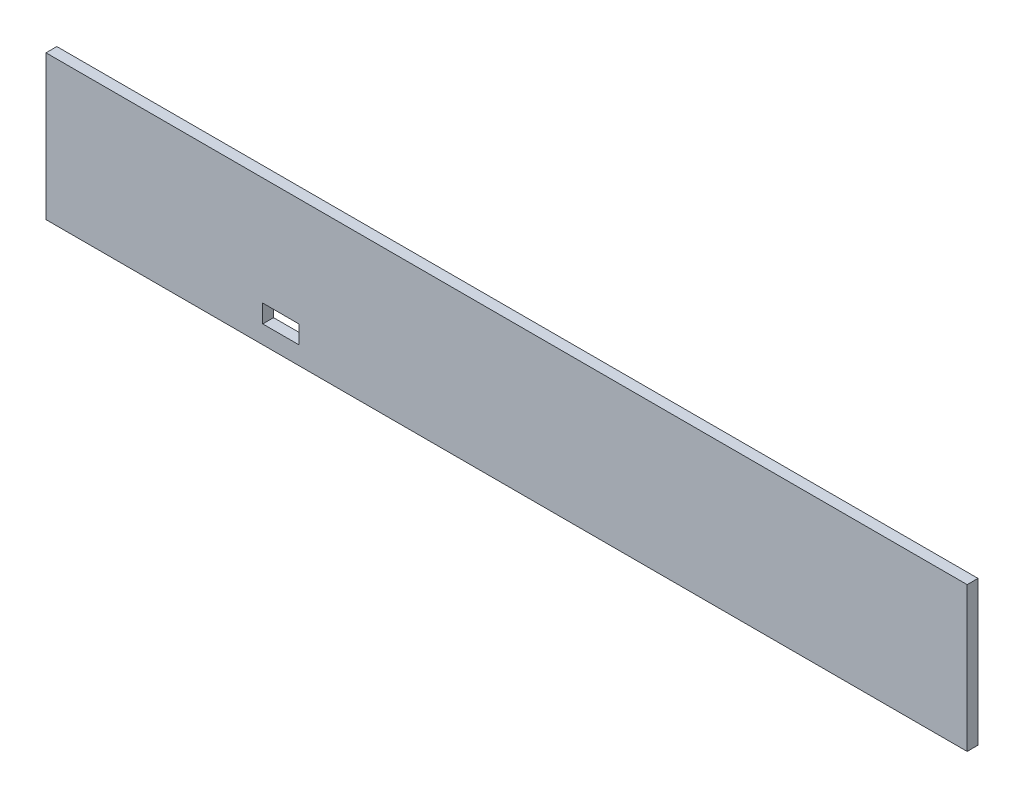
ISO-10303-21;
HEADER;
FILE_DESCRIPTION(('STEP AP214'),'2;1');
FILE_NAME('part.step','',(''),(''),'','','');
FILE_SCHEMA(('AUTOMOTIVE_DESIGN { 1 0 10303 214 1 1 1 1 }'));
ENDSEC;
DATA;
#1=APPLICATION_CONTEXT('core data for automotive mechanical design processes');
#2=APPLICATION_PROTOCOL_DEFINITION('international standard','automotive_design',2000,#1);
#3=PRODUCT_CONTEXT('',#1,'mechanical');
#4=PRODUCT('Part','Part','',(#3));
#5=PRODUCT_RELATED_PRODUCT_CATEGORY('part','',(#4));
#6=PRODUCT_DEFINITION_FORMATION('','',#4);
#7=PRODUCT_DEFINITION_CONTEXT('part definition',#1,'design');
#8=PRODUCT_DEFINITION('design','',#6,#7);
#9=PRODUCT_DEFINITION_SHAPE('','',#8);
#10=(LENGTH_UNIT() NAMED_UNIT(*) SI_UNIT(.MILLI.,.METRE.));
#11=(NAMED_UNIT(*) PLANE_ANGLE_UNIT() SI_UNIT($,.RADIAN.));
#12=(NAMED_UNIT(*) SI_UNIT($,.STERADIAN.) SOLID_ANGLE_UNIT());
#13=UNCERTAINTY_MEASURE_WITH_UNIT(LENGTH_MEASURE(1.E-05),#10,'distance_accuracy_value','');
#14=(GEOMETRIC_REPRESENTATION_CONTEXT(3) GLOBAL_UNCERTAINTY_ASSIGNED_CONTEXT((#13)) GLOBAL_UNIT_ASSIGNED_CONTEXT((#10,
#11,#12)) REPRESENTATION_CONTEXT('',''));
#15=CARTESIAN_POINT('',(0.,0.,0.));
#16=DIRECTION('',(0.,0.,1.));
#17=DIRECTION('',(1.,0.,0.));
#18=AXIS2_PLACEMENT_3D('',#15,#16,#17);
#19=CARTESIAN_POINT('',(0.,0.,3.));
#20=DIRECTION('',(0.,0.,1.));
#21=DIRECTION('',(1.,0.,0.));
#22=AXIS2_PLACEMENT_3D('',#19,#20,#21);
#23=PLANE('',#22);
#24=DIRECTION('',(0.,-1.,0.));
#25=VECTOR('',#24,1.);
#26=CARTESIAN_POINT('',(-61.6585365853659,21.126529834968,3.));
#27=LINE('',#26,#25);
#28=CARTESIAN_POINT('',(-61.6585365853659,21.126529834968,3.));
#29=VERTEX_POINT('',#28);
#30=CARTESIAN_POINT('',(-61.6585365853658,-18.873470165032,3.));
#31=VERTEX_POINT('',#30);
#32=EDGE_CURVE('E153',#29,#31,#27,.T.);
#33=ORIENTED_EDGE('',*,*,#32,.T.);
#34=DIRECTION('',(1.,0.,0.));
#35=VECTOR('',#34,1.);
#36=CARTESIAN_POINT('',(-61.6585365853658,-18.873470165032,3.));
#37=LINE('',#36,#35);
#38=CARTESIAN_POINT('',(193.341463414634,-18.873470165032,3.));
#39=VERTEX_POINT('',#38);
#40=EDGE_CURVE('E157',#31,#39,#37,.T.);
#41=ORIENTED_EDGE('',*,*,#40,.T.);
#42=DIRECTION('',(0.,1.,0.));
#43=VECTOR('',#42,1.);
#44=CARTESIAN_POINT('',(193.341463414634,21.126529834968,3.));
#45=LINE('',#44,#43);
#46=CARTESIAN_POINT('',(193.341463414634,21.126529834968,3.));
#47=VERTEX_POINT('',#46);
#48=EDGE_CURVE('E161',#39,#47,#45,.T.);
#49=ORIENTED_EDGE('',*,*,#48,.T.);
#50=DIRECTION('',(-1.,0.,0.));
#51=VECTOR('',#50,1.);
#52=CARTESIAN_POINT('',(-61.6585365853659,21.126529834968,3.));
#53=LINE('',#52,#51);
#54=EDGE_CURVE('E164',#47,#29,#53,.T.);
#55=ORIENTED_EDGE('',*,*,#54,.T.);
#56=EDGE_LOOP('',(#33,#41,#49,#55));
#57=FACE_BOUND('',#56,.T.);
#58=DIRECTION('',(1.,0.,0.));
#59=VECTOR('',#58,1.);
#60=CARTESIAN_POINT('',(-1.65853658536586,-13.873470165032,3.));
#61=LINE('',#60,#59);
#62=CARTESIAN_POINT('',(-1.65853658536586,-13.873470165032,3.));
#63=VERTEX_POINT('',#62);
#64=CARTESIAN_POINT('',(8.34146341463415,-13.873470165032,3.));
#65=VERTEX_POINT('',#64);
#66=EDGE_CURVE('E114',#63,#65,#61,.T.);
#67=ORIENTED_EDGE('',*,*,#66,.F.);
#68=DIRECTION('',(0.,-1.,0.));
#69=VECTOR('',#68,1.);
#70=CARTESIAN_POINT('',(-1.65853658536586,-8.87347016503196,3.));
#71=LINE('',#70,#69);
#72=CARTESIAN_POINT('',(-1.65853658536586,-8.87347016503196,3.));
#73=VERTEX_POINT('',#72);
#74=EDGE_CURVE('E105',#73,#63,#71,.T.);
#75=ORIENTED_EDGE('',*,*,#74,.F.);
#76=DIRECTION('',(-1.,0.,0.));
#77=VECTOR('',#76,1.);
#78=CARTESIAN_POINT('',(-1.65853658536586,-8.87347016503196,3.));
#79=LINE('',#78,#77);
#80=CARTESIAN_POINT('',(8.34146341463415,-8.87347016503195,3.));
#81=VERTEX_POINT('',#80);
#82=EDGE_CURVE('E131',#81,#73,#79,.T.);
#83=ORIENTED_EDGE('',*,*,#82,.F.);
#84=DIRECTION('',(0.,1.,0.));
#85=VECTOR('',#84,1.);
#86=CARTESIAN_POINT('',(8.34146341463415,-8.87347016503195,3.));
#87=LINE('',#86,#85);
#88=EDGE_CURVE('E127',#65,#81,#87,.T.);
#89=ORIENTED_EDGE('',*,*,#88,.F.);
#90=EDGE_LOOP('',(#67,#75,#83,#89));
#91=FACE_BOUND('',#90,.T.);
#92=ADVANCED_FACE('F39',(#57,#91),#23,.T.);
#93=CARTESIAN_POINT('',(0.,0.,0.));
#94=DIRECTION('',(0.,0.,1.));
#95=DIRECTION('',(1.,0.,0.));
#96=AXIS2_PLACEMENT_3D('',#93,#94,#95);
#97=PLANE('',#96);
#98=DIRECTION('',(0.,-1.,0.));
#99=VECTOR('',#98,1.);
#100=CARTESIAN_POINT('',(-61.6585365853659,21.126529834968,0.));
#101=LINE('',#100,#99);
#102=CARTESIAN_POINT('',(-61.6585365853659,21.126529834968,0.));
#103=VERTEX_POINT('',#102);
#104=CARTESIAN_POINT('',(-61.6585365853658,-18.873470165032,0.));
#105=VERTEX_POINT('',#104);
#106=EDGE_CURVE('E123',#103,#105,#101,.T.);
#107=ORIENTED_EDGE('',*,*,#106,.F.);
#108=DIRECTION('',(-1.,0.,0.));
#109=VECTOR('',#108,1.);
#110=CARTESIAN_POINT('',(-61.6585365853659,21.126529834968,0.));
#111=LINE('',#110,#109);
#112=CARTESIAN_POINT('',(193.341463414634,21.126529834968,0.));
#113=VERTEX_POINT('',#112);
#114=EDGE_CURVE('E158',#113,#103,#111,.T.);
#115=ORIENTED_EDGE('',*,*,#114,.F.);
#116=DIRECTION('',(0.,1.,0.));
#117=VECTOR('',#116,1.);
#118=CARTESIAN_POINT('',(193.341463414634,21.126529834968,0.));
#119=LINE('',#118,#117);
#120=CARTESIAN_POINT('',(193.341463414634,-18.873470165032,0.));
#121=VERTEX_POINT('',#120);
#122=EDGE_CURVE('E174',#121,#113,#119,.T.);
#123=ORIENTED_EDGE('',*,*,#122,.F.);
#124=DIRECTION('',(1.,0.,0.));
#125=VECTOR('',#124,1.);
#126=CARTESIAN_POINT('',(-61.6585365853658,-18.873470165032,0.));
#127=LINE('',#126,#125);
#128=EDGE_CURVE('E171',#105,#121,#127,.T.);
#129=ORIENTED_EDGE('',*,*,#128,.F.);
#130=EDGE_LOOP('',(#107,#115,#123,#129));
#131=FACE_BOUND('',#130,.T.);
#132=DIRECTION('',(0.,-1.,0.));
#133=VECTOR('',#132,1.);
#134=CARTESIAN_POINT('',(-1.65853658536586,-8.87347016503196,0.));
#135=LINE('',#134,#133);
#136=CARTESIAN_POINT('',(-1.65853658536586,-8.87347016503196,0.));
#137=VERTEX_POINT('',#136);
#138=CARTESIAN_POINT('',(-1.65853658536586,-13.873470165032,0.));
#139=VERTEX_POINT('',#138);
#140=EDGE_CURVE('E63',#137,#139,#135,.T.);
#141=ORIENTED_EDGE('',*,*,#140,.T.);
#142=DIRECTION('',(1.,0.,0.));
#143=VECTOR('',#142,1.);
#144=CARTESIAN_POINT('',(-1.65853658536586,-13.873470165032,0.));
#145=LINE('',#144,#143);
#146=CARTESIAN_POINT('',(8.34146341463415,-13.873470165032,0.));
#147=VERTEX_POINT('',#146);
#148=EDGE_CURVE('E121',#139,#147,#145,.T.);
#149=ORIENTED_EDGE('',*,*,#148,.T.);
#150=DIRECTION('',(0.,1.,0.));
#151=VECTOR('',#150,1.);
#152=CARTESIAN_POINT('',(8.34146341463415,-8.87347016503195,0.));
#153=LINE('',#152,#151);
#154=CARTESIAN_POINT('',(8.34146341463415,-8.87347016503195,0.));
#155=VERTEX_POINT('',#154);
#156=EDGE_CURVE('E140',#147,#155,#153,.T.);
#157=ORIENTED_EDGE('',*,*,#156,.T.);
#158=DIRECTION('',(-1.,0.,0.));
#159=VECTOR('',#158,1.);
#160=CARTESIAN_POINT('',(-1.65853658536586,-8.87347016503196,0.));
#161=LINE('',#160,#159);
#162=EDGE_CURVE('E115',#155,#137,#161,.T.);
#163=ORIENTED_EDGE('',*,*,#162,.T.);
#164=EDGE_LOOP('',(#141,#149,#157,#163));
#165=FACE_BOUND('',#164,.T.);
#166=ADVANCED_FACE('F197',(#131,#165),#97,.F.);
#167=CARTESIAN_POINT('',(-61.6585365853659,21.126529834968,3.));
#168=DIRECTION('',(1.,0.,0.));
#169=DIRECTION('',(0.,1.,0.));
#170=AXIS2_PLACEMENT_3D('',#167,#168,#169);
#171=PLANE('',#170);
#172=ORIENTED_EDGE('',*,*,#106,.T.);
#173=DIRECTION('',(0.,0.,-1.));
#174=VECTOR('',#173,1.);
#175=CARTESIAN_POINT('',(-61.6585365853658,-18.873470165032,3.));
#176=LINE('',#175,#174);
#177=EDGE_CURVE('E11',#31,#105,#176,.T.);
#178=ORIENTED_EDGE('',*,*,#177,.F.);
#179=ORIENTED_EDGE('',*,*,#32,.F.);
#180=DIRECTION('',(0.,0.,-1.));
#181=VECTOR('',#180,1.);
#182=CARTESIAN_POINT('',(-61.6585365853659,21.126529834968,3.));
#183=LINE('',#182,#181);
#184=EDGE_CURVE('E167',#29,#103,#183,.T.);
#185=ORIENTED_EDGE('',*,*,#184,.T.);
#186=EDGE_LOOP('',(#172,#178,#179,#185));
#187=FACE_BOUND('',#186,.T.);
#188=ADVANCED_FACE('F41',(#187),#171,.F.);
#189=CARTESIAN_POINT('',(-61.6585365853658,-18.873470165032,3.));
#190=DIRECTION('',(0.,1.,0.));
#191=DIRECTION('',(-1.,0.,0.));
#192=AXIS2_PLACEMENT_3D('',#189,#190,#191);
#193=PLANE('',#192);
#194=ORIENTED_EDGE('',*,*,#128,.T.);
#195=DIRECTION('',(0.,0.,-1.));
#196=VECTOR('',#195,1.);
#197=CARTESIAN_POINT('',(193.341463414634,-18.873470165032,3.));
#198=LINE('',#197,#196);
#199=EDGE_CURVE('E48',#39,#121,#198,.T.);
#200=ORIENTED_EDGE('',*,*,#199,.F.);
#201=ORIENTED_EDGE('',*,*,#40,.F.);
#202=ORIENTED_EDGE('',*,*,#177,.T.);
#203=EDGE_LOOP('',(#194,#200,#201,#202));
#204=FACE_BOUND('',#203,.T.);
#205=ADVANCED_FACE('F207',(#204),#193,.F.);
#206=CARTESIAN_POINT('',(193.341463414634,21.126529834968,3.));
#207=DIRECTION('',(-1.,0.,0.));
#208=DIRECTION('',(0.,0.,1.));
#209=AXIS2_PLACEMENT_3D('',#206,#207,#208);
#210=PLANE('',#209);
#211=ORIENTED_EDGE('',*,*,#122,.T.);
#212=DIRECTION('',(0.,0.,-1.));
#213=VECTOR('',#212,1.);
#214=CARTESIAN_POINT('',(193.341463414634,21.126529834968,3.));
#215=LINE('',#214,#213);
#216=EDGE_CURVE('E182',#47,#113,#215,.T.);
#217=ORIENTED_EDGE('',*,*,#216,.F.);
#218=ORIENTED_EDGE('',*,*,#48,.F.);
#219=ORIENTED_EDGE('',*,*,#199,.T.);
#220=EDGE_LOOP('',(#211,#217,#218,#219));
#221=FACE_BOUND('',#220,.T.);
#222=ADVANCED_FACE('F191',(#221),#210,.F.);
#223=CARTESIAN_POINT('',(-61.6585365853659,21.126529834968,3.));
#224=DIRECTION('',(0.,-1.,0.));
#225=DIRECTION('',(1.,0.,0.));
#226=AXIS2_PLACEMENT_3D('',#223,#224,#225);
#227=PLANE('',#226);
#228=ORIENTED_EDGE('',*,*,#114,.T.);
#229=ORIENTED_EDGE('',*,*,#184,.F.);
#230=ORIENTED_EDGE('',*,*,#54,.F.);
#231=ORIENTED_EDGE('',*,*,#216,.T.);
#232=EDGE_LOOP('',(#228,#229,#230,#231));
#233=FACE_BOUND('',#232,.T.);
#234=ADVANCED_FACE('F201',(#233),#227,.F.);
#235=CARTESIAN_POINT('',(-1.65853658536586,-8.87347016503196,3.));
#236=DIRECTION('',(1.,0.,0.));
#237=DIRECTION('',(0.,1.,0.));
#238=AXIS2_PLACEMENT_3D('',#235,#236,#237);
#239=PLANE('',#238);
#240=ORIENTED_EDGE('',*,*,#140,.F.);
#241=DIRECTION('',(0.,0.,-1.));
#242=VECTOR('',#241,1.);
#243=CARTESIAN_POINT('',(-1.65853658536586,-8.87347016503196,3.));
#244=LINE('',#243,#242);
#245=EDGE_CURVE('E109',#73,#137,#244,.T.);
#246=ORIENTED_EDGE('',*,*,#245,.F.);
#247=ORIENTED_EDGE('',*,*,#74,.T.);
#248=DIRECTION('',(0.,0.,-1.));
#249=VECTOR('',#248,1.);
#250=CARTESIAN_POINT('',(-1.65853658536586,-13.873470165032,3.));
#251=LINE('',#250,#249);
#252=EDGE_CURVE('E108',#63,#139,#251,.T.);
#253=ORIENTED_EDGE('',*,*,#252,.T.);
#254=EDGE_LOOP('',(#240,#246,#247,#253));
#255=FACE_BOUND('',#254,.T.);
#256=ADVANCED_FACE('F107',(#255),#239,.T.);
#257=CARTESIAN_POINT('',(-1.65853658536586,-13.873470165032,3.));
#258=DIRECTION('',(0.,1.,0.));
#259=DIRECTION('',(0.,0.,1.));
#260=AXIS2_PLACEMENT_3D('',#257,#258,#259);
#261=PLANE('',#260);
#262=ORIENTED_EDGE('',*,*,#148,.F.);
#263=ORIENTED_EDGE('',*,*,#252,.F.);
#264=ORIENTED_EDGE('',*,*,#66,.T.);
#265=DIRECTION('',(0.,0.,-1.));
#266=VECTOR('',#265,1.);
#267=CARTESIAN_POINT('',(8.34146341463415,-13.873470165032,3.));
#268=LINE('',#267,#266);
#269=EDGE_CURVE('E124',#65,#147,#268,.T.);
#270=ORIENTED_EDGE('',*,*,#269,.T.);
#271=EDGE_LOOP('',(#262,#263,#264,#270));
#272=FACE_BOUND('',#271,.T.);
#273=ADVANCED_FACE('F118',(#272),#261,.T.);
#274=CARTESIAN_POINT('',(8.34146341463415,-8.87347016503195,3.));
#275=DIRECTION('',(-1.,0.,0.));
#276=DIRECTION('',(0.,-1.,0.));
#277=AXIS2_PLACEMENT_3D('',#274,#275,#276);
#278=PLANE('',#277);
#279=ORIENTED_EDGE('',*,*,#156,.F.);
#280=ORIENTED_EDGE('',*,*,#269,.F.);
#281=ORIENTED_EDGE('',*,*,#88,.T.);
#282=DIRECTION('',(0.,0.,-1.));
#283=VECTOR('',#282,1.);
#284=CARTESIAN_POINT('',(8.34146341463415,-8.87347016503195,3.));
#285=LINE('',#284,#283);
#286=EDGE_CURVE('E55',#81,#155,#285,.T.);
#287=ORIENTED_EDGE('',*,*,#286,.T.);
#288=EDGE_LOOP('',(#279,#280,#281,#287));
#289=FACE_BOUND('',#288,.T.);
#290=ADVANCED_FACE('F230',(#289),#278,.T.);
#291=CARTESIAN_POINT('',(-1.65853658536586,-8.87347016503196,3.));
#292=DIRECTION('',(0.,-1.,0.));
#293=DIRECTION('',(1.,0.,0.));
#294=AXIS2_PLACEMENT_3D('',#291,#292,#293);
#295=PLANE('',#294);
#296=ORIENTED_EDGE('',*,*,#162,.F.);
#297=ORIENTED_EDGE('',*,*,#286,.F.);
#298=ORIENTED_EDGE('',*,*,#82,.T.);
#299=ORIENTED_EDGE('',*,*,#245,.T.);
#300=EDGE_LOOP('',(#296,#297,#298,#299));
#301=FACE_BOUND('',#300,.T.);
#302=ADVANCED_FACE('F234',(#301),#295,.T.);
#303=CLOSED_SHELL('',(#92,#166,#188,#205,#222,#234,#256,#273,#290,#302));
#304=MANIFOLD_SOLID_BREP('B2',#303);
#305=ADVANCED_BREP_SHAPE_REPRESENTATION('',(#18,#304),#14);
#306=SHAPE_DEFINITION_REPRESENTATION(#9,#305);
ENDSEC;
END-ISO-10303-21;
